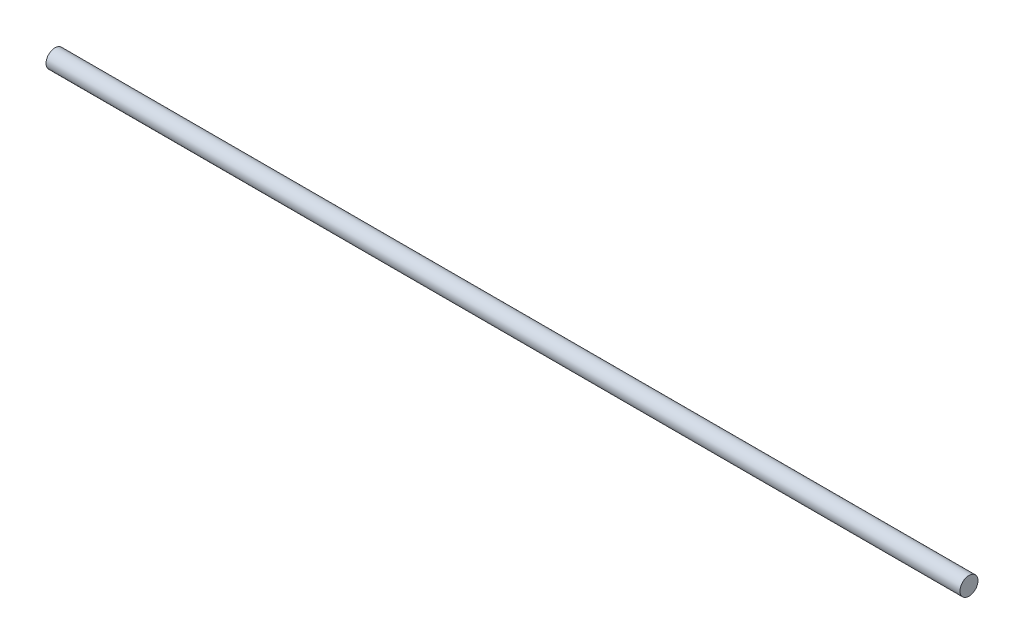
ISO-10303-21;
HEADER;
FILE_DESCRIPTION(('STEP AP214'),'2;1');
FILE_NAME('part.step','',(''),(''),'','','');
FILE_SCHEMA(('AUTOMOTIVE_DESIGN { 1 0 10303 214 1 1 1 1 }'));
ENDSEC;
DATA;
#1=APPLICATION_CONTEXT('core data for automotive mechanical design processes');
#2=APPLICATION_PROTOCOL_DEFINITION('international standard','automotive_design',2000,#1);
#3=PRODUCT_CONTEXT('',#1,'mechanical');
#4=PRODUCT('Part','Part','',(#3));
#5=PRODUCT_RELATED_PRODUCT_CATEGORY('part','',(#4));
#6=PRODUCT_DEFINITION_FORMATION('','',#4);
#7=PRODUCT_DEFINITION_CONTEXT('part definition',#1,'design');
#8=PRODUCT_DEFINITION('design','',#6,#7);
#9=PRODUCT_DEFINITION_SHAPE('','',#8);
#10=(LENGTH_UNIT() NAMED_UNIT(*) SI_UNIT(.MILLI.,.METRE.));
#11=(NAMED_UNIT(*) PLANE_ANGLE_UNIT() SI_UNIT($,.RADIAN.));
#12=(NAMED_UNIT(*) SI_UNIT($,.STERADIAN.) SOLID_ANGLE_UNIT());
#13=UNCERTAINTY_MEASURE_WITH_UNIT(LENGTH_MEASURE(1.E-05),#10,'distance_accuracy_value','');
#14=(GEOMETRIC_REPRESENTATION_CONTEXT(3) GLOBAL_UNCERTAINTY_ASSIGNED_CONTEXT((#13)) GLOBAL_UNIT_ASSIGNED_CONTEXT((#10,
#11,#12)) REPRESENTATION_CONTEXT('',''));
#15=CARTESIAN_POINT('',(0.,0.,0.));
#16=DIRECTION('',(0.,0.,1.));
#17=DIRECTION('',(1.,0.,0.));
#18=AXIS2_PLACEMENT_3D('',#15,#16,#17);
#19=CARTESIAN_POINT('',(202.5,0.,0.));
#20=DIRECTION('',(-1.,0.,0.));
#21=DIRECTION('',(0.,0.,1.));
#22=AXIS2_PLACEMENT_3D('',#19,#20,#21);
#23=CYLINDRICAL_SURFACE('',#22,4.);
#24=CARTESIAN_POINT('',(202.5,0.,0.));
#25=DIRECTION('',(1.,0.,0.));
#26=DIRECTION('',(0.,0.,-1.));
#27=AXIS2_PLACEMENT_3D('',#24,#25,#26);
#28=CIRCLE('',#27,4.);
#29=CARTESIAN_POINT('',(202.5,0.,-4.));
#30=VERTEX_POINT('',#29);
#31=EDGE_CURVE('E10',#30,#30,#28,.T.);
#32=ORIENTED_EDGE('',*,*,#31,.F.);
#33=EDGE_LOOP('',(#32));
#34=FACE_BOUND('',#33,.T.);
#35=CARTESIAN_POINT('',(-202.5,0.,0.));
#36=DIRECTION('',(1.,0.,0.));
#37=DIRECTION('',(0.,0.,-1.));
#38=AXIS2_PLACEMENT_3D('',#35,#36,#37);
#39=CIRCLE('',#38,4.);
#40=CARTESIAN_POINT('',(-202.5,0.,-4.));
#41=VERTEX_POINT('',#40);
#42=EDGE_CURVE('E33',#41,#41,#39,.T.);
#43=ORIENTED_EDGE('',*,*,#42,.T.);
#44=EDGE_LOOP('',(#43));
#45=FACE_BOUND('',#44,.T.);
#46=ADVANCED_FACE('F30',(#34,#45),#23,.T.);
#47=CARTESIAN_POINT('',(202.5,0.,0.));
#48=DIRECTION('',(1.,0.,0.));
#49=DIRECTION('',(0.,0.,-1.));
#50=AXIS2_PLACEMENT_3D('',#47,#48,#49);
#51=PLANE('',#50);
#52=ORIENTED_EDGE('',*,*,#31,.T.);
#53=EDGE_LOOP('',(#52));
#54=FACE_BOUND('',#53,.T.);
#55=ADVANCED_FACE('F45',(#54),#51,.T.);
#56=CARTESIAN_POINT('',(-202.5,0.,0.));
#57=DIRECTION('',(1.,0.,0.));
#58=DIRECTION('',(0.,0.,-1.));
#59=AXIS2_PLACEMENT_3D('',#56,#57,#58);
#60=PLANE('',#59);
#61=ORIENTED_EDGE('',*,*,#42,.F.);
#62=EDGE_LOOP('',(#61));
#63=FACE_BOUND('',#62,.T.);
#64=ADVANCED_FACE('F43',(#63),#60,.F.);
#65=CLOSED_SHELL('',(#46,#55,#64));
#66=MANIFOLD_SOLID_BREP('B2',#65);
#67=ADVANCED_BREP_SHAPE_REPRESENTATION('',(#18,#66),#14);
#68=SHAPE_DEFINITION_REPRESENTATION(#9,#67);
ENDSEC;
END-ISO-10303-21;
